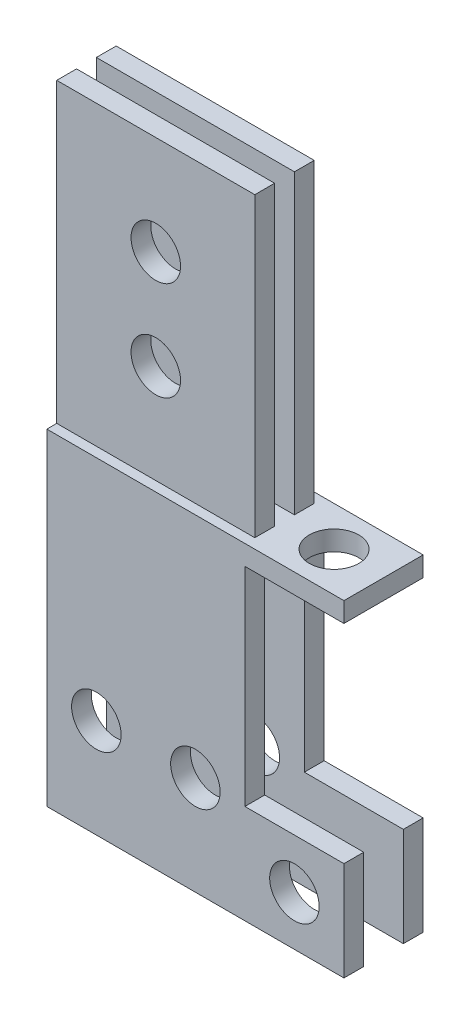
ISO-10303-21;
HEADER;
FILE_DESCRIPTION(('STEP AP214'),'2;1');
FILE_NAME('part.step','',(''),(''),'','','');
FILE_SCHEMA(('AUTOMOTIVE_DESIGN { 1 0 10303 214 1 1 1 1 }'));
ENDSEC;
DATA;
#1=APPLICATION_CONTEXT('core data for automotive mechanical design processes');
#2=APPLICATION_PROTOCOL_DEFINITION('international standard','automotive_design',2000,#1);
#3=PRODUCT_CONTEXT('',#1,'mechanical');
#4=PRODUCT('Part','Part','',(#3));
#5=PRODUCT_RELATED_PRODUCT_CATEGORY('part','',(#4));
#6=PRODUCT_DEFINITION_FORMATION('','',#4);
#7=PRODUCT_DEFINITION_CONTEXT('part definition',#1,'design');
#8=PRODUCT_DEFINITION('design','',#6,#7);
#9=PRODUCT_DEFINITION_SHAPE('','',#8);
#10=(LENGTH_UNIT() NAMED_UNIT(*) SI_UNIT(.MILLI.,.METRE.));
#11=(NAMED_UNIT(*) PLANE_ANGLE_UNIT() SI_UNIT($,.RADIAN.));
#12=(NAMED_UNIT(*) SI_UNIT($,.STERADIAN.) SOLID_ANGLE_UNIT());
#13=UNCERTAINTY_MEASURE_WITH_UNIT(LENGTH_MEASURE(1.E-05),#10,'distance_accuracy_value','');
#14=(GEOMETRIC_REPRESENTATION_CONTEXT(3) GLOBAL_UNCERTAINTY_ASSIGNED_CONTEXT((#13)) GLOBAL_UNIT_ASSIGNED_CONTEXT((#10,
#11,#12)) REPRESENTATION_CONTEXT('',''));
#15=CARTESIAN_POINT('',(0.,0.,0.));
#16=DIRECTION('',(0.,0.,1.));
#17=DIRECTION('',(1.,0.,0.));
#18=AXIS2_PLACEMENT_3D('',#15,#16,#17);
#19=CARTESIAN_POINT('',(0.,37.8144776815525,-4.));
#20=DIRECTION('',(0.,-1.,0.));
#21=DIRECTION('',(1.,0.,0.));
#22=AXIS2_PLACEMENT_3D('',#19,#20,#21);
#23=PLANE('',#22);
#24=CARTESIAN_POINT('',(-9.8418229000039,37.8144776815525,0.));
#25=DIRECTION('',(0.,1.,0.));
#26=DIRECTION('',(-1.,0.,0.));
#27=AXIS2_PLACEMENT_3D('',#24,#25,#26);
#28=CIRCLE('',#27,2.5);
#29=CARTESIAN_POINT('',(-12.3418229000039,37.8144776815525,0.));
#30=VERTEX_POINT('',#29);
#31=EDGE_CURVE('E367',#30,#30,#28,.T.);
#32=ORIENTED_EDGE('',*,*,#31,.F.);
#33=EDGE_LOOP('',(#32));
#34=FACE_BOUND('',#33,.T.);
#35=DIRECTION('',(1.,0.,0.));
#36=VECTOR('',#35,1.);
#37=CARTESIAN_POINT('',(0.,37.8144776815525,-3.));
#38=LINE('',#37,#36);
#39=CARTESIAN_POINT('',(-34.8418229000039,37.8144776815525,-3.));
#40=VERTEX_POINT('',#39);
#41=CARTESIAN_POINT('',(-14.8418229000039,37.8144776815525,-3.));
#42=VERTEX_POINT('',#41);
#43=EDGE_CURVE('E208',#40,#42,#38,.T.);
#44=ORIENTED_EDGE('',*,*,#43,.T.);
#45=DIRECTION('',(0.,0.,1.));
#46=VECTOR('',#45,1.);
#47=CARTESIAN_POINT('',(-14.8418229000039,37.8144776815525,-3.));
#48=LINE('',#47,#46);
#49=CARTESIAN_POINT('',(-14.8418229000039,37.8144776815525,-1.));
#50=VERTEX_POINT('',#49);
#51=EDGE_CURVE('E193',#42,#50,#48,.T.);
#52=ORIENTED_EDGE('',*,*,#51,.T.);
#53=DIRECTION('',(1.,0.,0.));
#54=VECTOR('',#53,1.);
#55=CARTESIAN_POINT('',(0.,37.8144776815525,-1.));
#56=LINE('',#55,#54);
#57=CARTESIAN_POINT('',(-34.8418229000039,37.8144776815525,-1.));
#58=VERTEX_POINT('',#57);
#59=EDGE_CURVE('E236',#58,#50,#56,.T.);
#60=ORIENTED_EDGE('',*,*,#59,.F.);
#61=DIRECTION('',(0.,0.,1.));
#62=VECTOR('',#61,1.);
#63=CARTESIAN_POINT('',(-34.8418229000039,37.8144776815525,-4.));
#64=LINE('',#63,#62);
#65=CARTESIAN_POINT('',(-34.8418229000039,37.8144776815525,1.));
#66=VERTEX_POINT('',#65);
#67=EDGE_CURVE('E501',#58,#66,#64,.T.);
#68=ORIENTED_EDGE('',*,*,#67,.T.);
#69=DIRECTION('',(1.,0.,0.));
#70=VECTOR('',#69,1.);
#71=CARTESIAN_POINT('',(0.,37.8144776815525,1.));
#72=LINE('',#71,#70);
#73=CARTESIAN_POINT('',(-14.8418229000039,37.8144776815525,1.));
#74=VERTEX_POINT('',#73);
#75=EDGE_CURVE('E67',#66,#74,#72,.T.);
#76=ORIENTED_EDGE('',*,*,#75,.T.);
#77=DIRECTION('',(0.,0.,-1.));
#78=VECTOR('',#77,1.);
#79=CARTESIAN_POINT('',(-14.8418229000039,37.8144776815525,3.));
#80=LINE('',#79,#78);
#81=CARTESIAN_POINT('',(-14.8418229000039,37.8144776815525,3.));
#82=VERTEX_POINT('',#81);
#83=EDGE_CURVE('E307',#82,#74,#80,.T.);
#84=ORIENTED_EDGE('',*,*,#83,.F.);
#85=DIRECTION('',(1.,0.,0.));
#86=VECTOR('',#85,1.);
#87=CARTESIAN_POINT('',(0.,37.8144776815525,3.));
#88=LINE('',#87,#86);
#89=CARTESIAN_POINT('',(-34.8418229000039,37.8144776815525,3.));
#90=VERTEX_POINT('',#89);
#91=EDGE_CURVE('E256',#90,#82,#88,.T.);
#92=ORIENTED_EDGE('',*,*,#91,.F.);
#93=CARTESIAN_POINT('',(-34.8418229000039,37.8144776815525,4.));
#94=VERTEX_POINT('',#93);
#95=EDGE_CURVE('E495',#90,#94,#64,.T.);
#96=ORIENTED_EDGE('',*,*,#95,.T.);
#97=DIRECTION('',(1.,0.,0.));
#98=VECTOR('',#97,1.);
#99=CARTESIAN_POINT('',(0.,37.8144776815525,4.));
#100=LINE('',#99,#98);
#101=CARTESIAN_POINT('',(-4.8418229000039,37.8144776815525,4.));
#102=VERTEX_POINT('',#101);
#103=EDGE_CURVE('E481',#94,#102,#100,.T.);
#104=ORIENTED_EDGE('',*,*,#103,.T.);
#105=DIRECTION('',(0.,0.,-1.));
#106=VECTOR('',#105,1.);
#107=CARTESIAN_POINT('',(-4.8418229000039,37.8144776815525,4.));
#108=LINE('',#107,#106);
#109=CARTESIAN_POINT('',(-4.8418229000039,37.8144776815525,-4.));
#110=VERTEX_POINT('',#109);
#111=EDGE_CURVE('E377',#102,#110,#108,.T.);
#112=ORIENTED_EDGE('',*,*,#111,.T.);
#113=DIRECTION('',(1.,0.,0.));
#114=VECTOR('',#113,1.);
#115=CARTESIAN_POINT('',(0.,37.8144776815525,-4.));
#116=LINE('',#115,#114);
#117=CARTESIAN_POINT('',(-34.8418229000039,37.8144776815525,-4.));
#118=VERTEX_POINT('',#117);
#119=EDGE_CURVE('E490',#118,#110,#116,.T.);
#120=ORIENTED_EDGE('',*,*,#119,.F.);
#121=EDGE_CURVE('E45',#118,#40,#64,.T.);
#122=ORIENTED_EDGE('',*,*,#121,.T.);
#123=EDGE_LOOP('',(#44,#52,#60,#68,#76,#84,#92,#96,#104,#112,#120,#122));
#124=FACE_BOUND('',#123,.T.);
#125=ADVANCED_FACE('F41',(#34,#124),#23,.F.);
#126=CARTESIAN_POINT('',(-14.8418229000039,0.,-4.));
#127=DIRECTION('',(-1.,0.,0.));
#128=DIRECTION('',(0.,0.,1.));
#129=AXIS2_PLACEMENT_3D('',#126,#127,#128);
#130=PLANE('',#129);
#131=DIRECTION('',(0.,-1.,0.));
#132=VECTOR('',#131,1.);
#133=CARTESIAN_POINT('',(-14.8418229000039,0.,-4.));
#134=LINE('',#133,#132);
#135=CARTESIAN_POINT('',(-14.8418229000039,35.8144776815525,-4.));
#136=VERTEX_POINT('',#135);
#137=CARTESIAN_POINT('',(-14.8418229000039,14.8144776815525,-4.));
#138=VERTEX_POINT('',#137);
#139=EDGE_CURVE('E487',#136,#138,#134,.T.);
#140=ORIENTED_EDGE('',*,*,#139,.F.);
#141=DIRECTION('',(0.,0.,1.));
#142=VECTOR('',#141,1.);
#143=CARTESIAN_POINT('',(-14.8418229000039,35.8144776815525,4.));
#144=LINE('',#143,#142);
#145=CARTESIAN_POINT('',(-14.8418229000039,35.8144776815525,4.));
#146=VERTEX_POINT('',#145);
#147=EDGE_CURVE('E381',#136,#146,#144,.T.);
#148=ORIENTED_EDGE('',*,*,#147,.T.);
#149=DIRECTION('',(0.,-1.,0.));
#150=VECTOR('',#149,1.);
#151=CARTESIAN_POINT('',(-14.8418229000039,0.,4.));
#152=LINE('',#151,#150);
#153=CARTESIAN_POINT('',(-14.8418229000039,14.8144776815525,4.));
#154=VERTEX_POINT('',#153);
#155=EDGE_CURVE('E478',#146,#154,#152,.T.);
#156=ORIENTED_EDGE('',*,*,#155,.T.);
#157=DIRECTION('',(0.,0.,-1.));
#158=VECTOR('',#157,1.);
#159=CARTESIAN_POINT('',(-14.8418229000039,14.8144776815525,4.));
#160=LINE('',#159,#158);
#161=CARTESIAN_POINT('',(-14.8418229000039,14.8144776815525,2.));
#162=VERTEX_POINT('',#161);
#163=EDGE_CURVE('E432',#154,#162,#160,.T.);
#164=ORIENTED_EDGE('',*,*,#163,.T.);
#165=DIRECTION('',(0.,-1.,0.));
#166=VECTOR('',#165,1.);
#167=CARTESIAN_POINT('',(-14.8418229000039,0.,2.));
#168=LINE('',#167,#166);
#169=CARTESIAN_POINT('',(-14.8418229000039,34.8144776815525,2.));
#170=VERTEX_POINT('',#169);
#171=EDGE_CURVE('E405',#170,#162,#168,.T.);
#172=ORIENTED_EDGE('',*,*,#171,.F.);
#173=DIRECTION('',(0.,0.,1.));
#174=VECTOR('',#173,1.);
#175=CARTESIAN_POINT('',(-14.8418229000039,34.8144776815525,-4.));
#176=LINE('',#175,#174);
#177=CARTESIAN_POINT('',(-14.8418229000039,34.8144776815525,-2.));
#178=VERTEX_POINT('',#177);
#179=EDGE_CURVE('E11',#178,#170,#176,.T.);
#180=ORIENTED_EDGE('',*,*,#179,.F.);
#181=DIRECTION('',(0.,-1.,0.));
#182=VECTOR('',#181,1.);
#183=CARTESIAN_POINT('',(-14.8418229000039,0.,-2.));
#184=LINE('',#183,#182);
#185=CARTESIAN_POINT('',(-14.8418229000039,14.8144776815525,-2.));
#186=VERTEX_POINT('',#185);
#187=EDGE_CURVE('E325',#178,#186,#184,.T.);
#188=ORIENTED_EDGE('',*,*,#187,.T.);
#189=DIRECTION('',(0.,0.,1.));
#190=VECTOR('',#189,1.);
#191=CARTESIAN_POINT('',(-14.8418229000039,14.8144776815525,-4.));
#192=LINE('',#191,#190);
#193=EDGE_CURVE('E349',#138,#186,#192,.T.);
#194=ORIENTED_EDGE('',*,*,#193,.F.);
#195=EDGE_LOOP('',(#140,#148,#156,#164,#172,#180,#188,#194));
#196=FACE_BOUND('',#195,.T.);
#197=ADVANCED_FACE('F43',(#196),#130,.F.);
#198=CARTESIAN_POINT('',(0.,34.8144776815525,-4.));
#199=DIRECTION('',(0.,-1.,0.));
#200=DIRECTION('',(0.,0.,-1.));
#201=AXIS2_PLACEMENT_3D('',#198,#199,#200);
#202=PLANE('',#201);
#203=DIRECTION('',(1.,0.,0.));
#204=VECTOR('',#203,1.);
#205=CARTESIAN_POINT('',(0.,34.8144776815525,-2.));
#206=LINE('',#205,#204);
#207=CARTESIAN_POINT('',(-34.8418229000039,34.8144776815525,-2.));
#208=VERTEX_POINT('',#207);
#209=EDGE_CURVE('E329',#208,#178,#206,.T.);
#210=ORIENTED_EDGE('',*,*,#209,.T.);
#211=ORIENTED_EDGE('',*,*,#179,.T.);
#212=DIRECTION('',(1.,0.,0.));
#213=VECTOR('',#212,1.);
#214=CARTESIAN_POINT('',(0.,34.8144776815525,2.));
#215=LINE('',#214,#213);
#216=CARTESIAN_POINT('',(-34.8418229000039,34.8144776815525,2.));
#217=VERTEX_POINT('',#216);
#218=EDGE_CURVE('E436',#217,#170,#215,.T.);
#219=ORIENTED_EDGE('',*,*,#218,.F.);
#220=DIRECTION('',(0.,0.,1.));
#221=VECTOR('',#220,1.);
#222=CARTESIAN_POINT('',(-34.8418229000039,34.8144776815525,-4.));
#223=LINE('',#222,#221);
#224=EDGE_CURVE('E51',#208,#217,#223,.T.);
#225=ORIENTED_EDGE('',*,*,#224,.F.);
#226=EDGE_LOOP('',(#210,#211,#219,#225));
#227=FACE_BOUND('',#226,.T.);
#228=ADVANCED_FACE('F539',(#227),#202,.T.);
#229=CARTESIAN_POINT('',(-34.8418229000039,0.,-4.));
#230=DIRECTION('',(-1.,0.,0.));
#231=DIRECTION('',(0.,0.,1.));
#232=AXIS2_PLACEMENT_3D('',#229,#230,#231);
#233=PLANE('',#232);
#234=DIRECTION('',(0.,-1.,0.));
#235=VECTOR('',#234,1.);
#236=CARTESIAN_POINT('',(-34.8418229000039,0.,-4.));
#237=LINE('',#236,#235);
#238=CARTESIAN_POINT('',(-34.8418229000039,4.81447768155247,-4.));
#239=VERTEX_POINT('',#238);
#240=EDGE_CURVE('E493',#118,#239,#237,.T.);
#241=ORIENTED_EDGE('',*,*,#240,.T.);
#242=DIRECTION('',(0.,0.,1.));
#243=VECTOR('',#242,1.);
#244=CARTESIAN_POINT('',(-34.8418229000039,4.81447768155247,-4.));
#245=LINE('',#244,#243);
#246=CARTESIAN_POINT('',(-34.8418229000039,4.81447768155247,-2.));
#247=VERTEX_POINT('',#246);
#248=EDGE_CURVE('E324',#239,#247,#245,.T.);
#249=ORIENTED_EDGE('',*,*,#248,.T.);
#250=DIRECTION('',(0.,-1.,0.));
#251=VECTOR('',#250,1.);
#252=CARTESIAN_POINT('',(-34.8418229000039,0.,-2.));
#253=LINE('',#252,#251);
#254=EDGE_CURVE('E333',#208,#247,#253,.T.);
#255=ORIENTED_EDGE('',*,*,#254,.F.);
#256=ORIENTED_EDGE('',*,*,#224,.T.);
#257=DIRECTION('',(0.,-1.,0.));
#258=VECTOR('',#257,1.);
#259=CARTESIAN_POINT('',(-34.8418229000039,0.,2.));
#260=LINE('',#259,#258);
#261=CARTESIAN_POINT('',(-34.8418229000039,4.81447768155247,2.));
#262=VERTEX_POINT('',#261);
#263=EDGE_CURVE('E440',#217,#262,#260,.T.);
#264=ORIENTED_EDGE('',*,*,#263,.T.);
#265=DIRECTION('',(0.,0.,-1.));
#266=VECTOR('',#265,1.);
#267=CARTESIAN_POINT('',(-34.8418229000039,4.81447768155247,4.));
#268=LINE('',#267,#266);
#269=CARTESIAN_POINT('',(-34.8418229000039,4.81447768155247,4.));
#270=VERTEX_POINT('',#269);
#271=EDGE_CURVE('E474',#270,#262,#268,.T.);
#272=ORIENTED_EDGE('',*,*,#271,.F.);
#273=DIRECTION('',(0.,-1.,0.));
#274=VECTOR('',#273,1.);
#275=CARTESIAN_POINT('',(-34.8418229000039,0.,4.));
#276=LINE('',#275,#274);
#277=EDGE_CURVE('E484',#94,#270,#276,.T.);
#278=ORIENTED_EDGE('',*,*,#277,.F.);
#279=ORIENTED_EDGE('',*,*,#95,.F.);
#280=DIRECTION('',(0.,1.,0.));
#281=VECTOR('',#280,1.);
#282=CARTESIAN_POINT('',(-34.8418229000039,0.,3.));
#283=LINE('',#282,#281);
#284=CARTESIAN_POINT('',(-34.8418229000039,67.8144776815525,3.));
#285=VERTEX_POINT('',#284);
#286=EDGE_CURVE('E268',#90,#285,#283,.T.);
#287=ORIENTED_EDGE('',*,*,#286,.T.);
#288=DIRECTION('',(0.,0.,-1.));
#289=VECTOR('',#288,1.);
#290=CARTESIAN_POINT('',(-34.8418229000039,67.8144776815525,3.));
#291=LINE('',#290,#289);
#292=CARTESIAN_POINT('',(-34.8418229000039,67.8144776815525,1.));
#293=VERTEX_POINT('',#292);
#294=EDGE_CURVE('E280',#285,#293,#291,.T.);
#295=ORIENTED_EDGE('',*,*,#294,.T.);
#296=DIRECTION('',(0.,1.,0.));
#297=VECTOR('',#296,1.);
#298=CARTESIAN_POINT('',(-34.8418229000039,0.,1.));
#299=LINE('',#298,#297);
#300=EDGE_CURVE('E291',#66,#293,#299,.T.);
#301=ORIENTED_EDGE('',*,*,#300,.F.);
#302=ORIENTED_EDGE('',*,*,#67,.F.);
#303=DIRECTION('',(0.,1.,0.));
#304=VECTOR('',#303,1.);
#305=CARTESIAN_POINT('',(-34.8418229000039,0.,-1.));
#306=LINE('',#305,#304);
#307=CARTESIAN_POINT('',(-34.8418229000039,67.8144776815525,-1.));
#308=VERTEX_POINT('',#307);
#309=EDGE_CURVE('E59',#58,#308,#306,.T.);
#310=ORIENTED_EDGE('',*,*,#309,.T.);
#311=DIRECTION('',(0.,0.,1.));
#312=VECTOR('',#311,1.);
#313=CARTESIAN_POINT('',(-34.8418229000039,67.8144776815525,-3.));
#314=LINE('',#313,#312);
#315=CARTESIAN_POINT('',(-34.8418229000039,67.8144776815525,-3.));
#316=VERTEX_POINT('',#315);
#317=EDGE_CURVE('E250',#316,#308,#314,.T.);
#318=ORIENTED_EDGE('',*,*,#317,.F.);
#319=DIRECTION('',(0.,1.,0.));
#320=VECTOR('',#319,1.);
#321=CARTESIAN_POINT('',(-34.8418229000039,0.,-3.));
#322=LINE('',#321,#320);
#323=EDGE_CURVE('E226',#40,#316,#322,.T.);
#324=ORIENTED_EDGE('',*,*,#323,.F.);
#325=ORIENTED_EDGE('',*,*,#121,.F.);
#326=EDGE_LOOP('',(#241,#249,#255,#256,#264,#272,#278,#279,#287,#295,#301,#302,#310,#318,#324,#325));
#327=FACE_BOUND('',#326,.T.);
#328=ADVANCED_FACE('F509',(#327),#233,.T.);
#329=CARTESIAN_POINT('',(0.,0.,-4.));
#330=DIRECTION('',(0.,0.,1.));
#331=DIRECTION('',(1.,0.,0.));
#332=AXIS2_PLACEMENT_3D('',#329,#330,#331);
#333=PLANE('',#332);
#334=ORIENTED_EDGE('',*,*,#119,.T.);
#335=DIRECTION('',(0.,1.,0.));
#336=VECTOR('',#335,1.);
#337=CARTESIAN_POINT('',(-4.8418229000039,35.8144776815525,-4.));
#338=LINE('',#337,#336);
#339=CARTESIAN_POINT('',(-4.8418229000039,35.8144776815525,-4.));
#340=VERTEX_POINT('',#339);
#341=EDGE_CURVE('E401',#340,#110,#338,.T.);
#342=ORIENTED_EDGE('',*,*,#341,.F.);
#343=DIRECTION('',(-1.,0.,0.));
#344=VECTOR('',#343,1.);
#345=CARTESIAN_POINT('',(-14.8418229000039,35.8144776815525,-4.));
#346=LINE('',#345,#344);
#347=EDGE_CURVE('E393',#340,#136,#346,.T.);
#348=ORIENTED_EDGE('',*,*,#347,.T.);
#349=ORIENTED_EDGE('',*,*,#139,.T.);
#350=DIRECTION('',(1.,0.,0.));
#351=VECTOR('',#350,1.);
#352=CARTESIAN_POINT('',(-14.8418229000039,14.8144776815525,-4.));
#353=LINE('',#352,#351);
#354=CARTESIAN_POINT('',(-4.8418229000039,14.8144776815525,-4.));
#355=VERTEX_POINT('',#354);
#356=EDGE_CURVE('E354',#138,#355,#353,.T.);
#357=ORIENTED_EDGE('',*,*,#356,.T.);
#358=DIRECTION('',(0.,1.,0.));
#359=VECTOR('',#358,1.);
#360=CARTESIAN_POINT('',(-4.8418229000039,4.81447768155247,-4.));
#361=LINE('',#360,#359);
#362=CARTESIAN_POINT('',(-4.8418229000039,4.81447768155247,-4.));
#363=VERTEX_POINT('',#362);
#364=EDGE_CURVE('E350',#363,#355,#361,.T.);
#365=ORIENTED_EDGE('',*,*,#364,.F.);
#366=DIRECTION('',(1.,0.,0.));
#367=VECTOR('',#366,1.);
#368=CARTESIAN_POINT('',(0.,4.81447768155247,-4.));
#369=LINE('',#368,#367);
#370=EDGE_CURVE('E312',#239,#363,#369,.T.);
#371=ORIENTED_EDGE('',*,*,#370,.F.);
#372=ORIENTED_EDGE('',*,*,#240,.F.);
#373=EDGE_LOOP('',(#334,#342,#348,#349,#357,#365,#371,#372));
#374=FACE_BOUND('',#373,.T.);
#375=CARTESIAN_POINT('',(-29.8418229000039,14.8144776815525,-4.));
#376=DIRECTION('',(0.,0.,1.));
#377=DIRECTION('',(1.,0.,0.));
#378=AXIS2_PLACEMENT_3D('',#375,#376,#377);
#379=CIRCLE('',#378,2.5);
#380=CARTESIAN_POINT('',(-27.3418229000039,14.8144776815525,-4.));
#381=VERTEX_POINT('',#380);
#382=EDGE_CURVE('E315',#381,#381,#379,.T.);
#383=ORIENTED_EDGE('',*,*,#382,.T.);
#384=EDGE_LOOP('',(#383));
#385=FACE_BOUND('',#384,.T.);
#386=CARTESIAN_POINT('',(-19.8418229000039,14.8144776815525,-4.));
#387=DIRECTION('',(0.,0.,1.));
#388=DIRECTION('',(1.,0.,0.));
#389=AXIS2_PLACEMENT_3D('',#386,#387,#388);
#390=CIRCLE('',#389,2.5);
#391=CARTESIAN_POINT('',(-17.3418229000039,14.8144776815525,-4.));
#392=VERTEX_POINT('',#391);
#393=EDGE_CURVE('E320',#392,#392,#390,.F.);
#394=ORIENTED_EDGE('',*,*,#393,.F.);
#395=EDGE_LOOP('',(#394));
#396=FACE_BOUND('',#395,.T.);
#397=ADVANCED_FACE('F522',(#374,#385,#396),#333,.F.);
#398=CARTESIAN_POINT('',(0.,0.,4.));
#399=DIRECTION('',(0.,0.,1.));
#400=DIRECTION('',(1.,0.,0.));
#401=AXIS2_PLACEMENT_3D('',#398,#399,#400);
#402=PLANE('',#401);
#403=ORIENTED_EDGE('',*,*,#155,.F.);
#404=DIRECTION('',(1.,0.,0.));
#405=VECTOR('',#404,1.);
#406=CARTESIAN_POINT('',(-14.8418229000039,35.8144776815525,4.));
#407=LINE('',#406,#405);
#408=CARTESIAN_POINT('',(-4.8418229000039,35.8144776815525,4.));
#409=VERTEX_POINT('',#408);
#410=EDGE_CURVE('E385',#146,#409,#407,.T.);
#411=ORIENTED_EDGE('',*,*,#410,.T.);
#412=DIRECTION('',(0.,1.,0.));
#413=VECTOR('',#412,1.);
#414=CARTESIAN_POINT('',(-4.8418229000039,35.8144776815525,4.));
#415=LINE('',#414,#413);
#416=EDGE_CURVE('E397',#409,#102,#415,.T.);
#417=ORIENTED_EDGE('',*,*,#416,.T.);
#418=ORIENTED_EDGE('',*,*,#103,.F.);
#419=ORIENTED_EDGE('',*,*,#277,.T.);
#420=DIRECTION('',(1.,0.,0.));
#421=VECTOR('',#420,1.);
#422=CARTESIAN_POINT('',(0.,4.81447768155247,4.));
#423=LINE('',#422,#421);
#424=CARTESIAN_POINT('',(-4.8418229000039,4.81447768155247,4.));
#425=VERTEX_POINT('',#424);
#426=EDGE_CURVE('E409',#270,#425,#423,.T.);
#427=ORIENTED_EDGE('',*,*,#426,.T.);
#428=DIRECTION('',(0.,1.,0.));
#429=VECTOR('',#428,1.);
#430=CARTESIAN_POINT('',(-4.8418229000039,0.,4.));
#431=LINE('',#430,#429);
#432=CARTESIAN_POINT('',(-4.8418229000039,14.8144776815525,4.));
#433=VERTEX_POINT('',#432);
#434=EDGE_CURVE('E412',#425,#433,#431,.T.);
#435=ORIENTED_EDGE('',*,*,#434,.T.);
#436=DIRECTION('',(1.,0.,0.));
#437=VECTOR('',#436,1.);
#438=CARTESIAN_POINT('',(0.,14.8144776815525,4.));
#439=LINE('',#438,#437);
#440=EDGE_CURVE('E416',#154,#433,#439,.T.);
#441=ORIENTED_EDGE('',*,*,#440,.F.);
#442=EDGE_LOOP('',(#403,#411,#417,#418,#419,#427,#435,#441));
#443=FACE_BOUND('',#442,.T.);
#444=CARTESIAN_POINT('',(-29.8418229000039,14.8144776815525,4.));
#445=DIRECTION('',(0.,0.,1.));
#446=DIRECTION('',(1.,0.,0.));
#447=AXIS2_PLACEMENT_3D('',#444,#445,#446);
#448=CIRCLE('',#447,2.5);
#449=CARTESIAN_POINT('',(-27.3418229000039,14.8144776815525,4.));
#450=VERTEX_POINT('',#449);
#451=EDGE_CURVE('E420',#450,#450,#448,.T.);
#452=ORIENTED_EDGE('',*,*,#451,.F.);
#453=EDGE_LOOP('',(#452));
#454=FACE_BOUND('',#453,.T.);
#455=CARTESIAN_POINT('',(-19.8418229000039,14.8144776815525,4.));
#456=DIRECTION('',(0.,0.,1.));
#457=DIRECTION('',(1.,0.,0.));
#458=AXIS2_PLACEMENT_3D('',#455,#456,#457);
#459=CIRCLE('',#458,2.5);
#460=CARTESIAN_POINT('',(-17.3418229000039,14.8144776815525,4.));
#461=VERTEX_POINT('',#460);
#462=EDGE_CURVE('E424',#461,#461,#459,.F.);
#463=ORIENTED_EDGE('',*,*,#462,.T.);
#464=EDGE_LOOP('',(#463));
#465=FACE_BOUND('',#464,.T.);
#466=CARTESIAN_POINT('',(-9.8418229000039,9.81447768155247,4.));
#467=DIRECTION('',(0.,0.,1.));
#468=DIRECTION('',(1.,0.,0.));
#469=AXIS2_PLACEMENT_3D('',#466,#467,#468);
#470=CIRCLE('',#469,2.5);
#471=CARTESIAN_POINT('',(-7.3418229000039,9.81447768155247,4.));
#472=VERTEX_POINT('',#471);
#473=EDGE_CURVE('E428',#472,#472,#470,.T.);
#474=ORIENTED_EDGE('',*,*,#473,.F.);
#475=EDGE_LOOP('',(#474));
#476=FACE_BOUND('',#475,.T.);
#477=ADVANCED_FACE('F512',(#443,#454,#465,#476),#402,.T.);
#478=CARTESIAN_POINT('',(0.,4.81447768155247,4.));
#479=DIRECTION('',(0.,1.,0.));
#480=DIRECTION('',(0.,0.,1.));
#481=AXIS2_PLACEMENT_3D('',#478,#479,#480);
#482=PLANE('',#481);
#483=DIRECTION('',(1.,0.,0.));
#484=VECTOR('',#483,1.);
#485=CARTESIAN_POINT('',(0.,4.81447768155247,2.));
#486=LINE('',#485,#484);
#487=CARTESIAN_POINT('',(-4.8418229000039,4.81447768155247,2.));
#488=VERTEX_POINT('',#487);
#489=EDGE_CURVE('E443',#262,#488,#486,.T.);
#490=ORIENTED_EDGE('',*,*,#489,.T.);
#491=DIRECTION('',(0.,0.,-1.));
#492=VECTOR('',#491,1.);
#493=CARTESIAN_POINT('',(-4.8418229000039,4.81447768155247,4.));
#494=LINE('',#493,#492);
#495=EDGE_CURVE('E470',#425,#488,#494,.T.);
#496=ORIENTED_EDGE('',*,*,#495,.F.);
#497=ORIENTED_EDGE('',*,*,#426,.F.);
#498=ORIENTED_EDGE('',*,*,#271,.T.);
#499=EDGE_LOOP('',(#490,#496,#497,#498));
#500=FACE_BOUND('',#499,.T.);
#501=ADVANCED_FACE('F552',(#500),#482,.F.);
#502=CARTESIAN_POINT('',(-4.8418229000039,0.,4.));
#503=DIRECTION('',(-1.,0.,0.));
#504=DIRECTION('',(0.,0.,1.));
#505=AXIS2_PLACEMENT_3D('',#502,#503,#504);
#506=PLANE('',#505);
#507=DIRECTION('',(0.,1.,0.));
#508=VECTOR('',#507,1.);
#509=CARTESIAN_POINT('',(-4.8418229000039,0.,2.));
#510=LINE('',#509,#508);
#511=CARTESIAN_POINT('',(-4.8418229000039,14.8144776815525,2.));
#512=VERTEX_POINT('',#511);
#513=EDGE_CURVE('E446',#488,#512,#510,.T.);
#514=ORIENTED_EDGE('',*,*,#513,.T.);
#515=DIRECTION('',(0.,0.,-1.));
#516=VECTOR('',#515,1.);
#517=CARTESIAN_POINT('',(-4.8418229000039,14.8144776815525,4.));
#518=LINE('',#517,#516);
#519=EDGE_CURVE('E467',#433,#512,#518,.T.);
#520=ORIENTED_EDGE('',*,*,#519,.F.);
#521=ORIENTED_EDGE('',*,*,#434,.F.);
#522=ORIENTED_EDGE('',*,*,#495,.T.);
#523=EDGE_LOOP('',(#514,#520,#521,#522));
#524=FACE_BOUND('',#523,.T.);
#525=ADVANCED_FACE('F558',(#524),#506,.F.);
#526=CARTESIAN_POINT('',(-19.8418229000039,14.8144776815525,4.));
#527=DIRECTION('',(0.,0.,-1.));
#528=DIRECTION('',(-1.,0.,0.));
#529=AXIS2_PLACEMENT_3D('',#526,#527,#528);
#530=CYLINDRICAL_SURFACE('',#529,2.5);
#531=ORIENTED_EDGE('',*,*,#462,.F.);
#532=EDGE_LOOP('',(#531));
#533=FACE_BOUND('',#532,.T.);
#534=CARTESIAN_POINT('',(-19.8418229000039,14.8144776815525,2.));
#535=DIRECTION('',(0.,0.,1.));
#536=DIRECTION('',(1.,0.,0.));
#537=AXIS2_PLACEMENT_3D('',#534,#535,#536);
#538=CIRCLE('',#537,2.5);
#539=CARTESIAN_POINT('',(-17.3418229000039,14.8144776815525,2.));
#540=VERTEX_POINT('',#539);
#541=EDGE_CURVE('E458',#540,#540,#538,.F.);
#542=ORIENTED_EDGE('',*,*,#541,.T.);
#543=EDGE_LOOP('',(#542));
#544=FACE_BOUND('',#543,.T.);
#545=ADVANCED_FACE('F571',(#533,#544),#530,.F.);
#546=CARTESIAN_POINT('',(-29.8418229000039,14.8144776815525,4.));
#547=DIRECTION('',(0.,0.,-1.));
#548=DIRECTION('',(-1.,0.,0.));
#549=AXIS2_PLACEMENT_3D('',#546,#547,#548);
#550=CYLINDRICAL_SURFACE('',#549,2.5);
#551=ORIENTED_EDGE('',*,*,#451,.T.);
#552=EDGE_LOOP('',(#551));
#553=FACE_BOUND('',#552,.T.);
#554=CARTESIAN_POINT('',(-29.8418229000039,14.8144776815525,2.));
#555=DIRECTION('',(0.,0.,1.));
#556=DIRECTION('',(1.,0.,0.));
#557=AXIS2_PLACEMENT_3D('',#554,#555,#556);
#558=CIRCLE('',#557,2.5);
#559=CARTESIAN_POINT('',(-27.3418229000039,14.8144776815525,2.));
#560=VERTEX_POINT('',#559);
#561=EDGE_CURVE('E454',#560,#560,#558,.T.);
#562=ORIENTED_EDGE('',*,*,#561,.F.);
#563=EDGE_LOOP('',(#562));
#564=FACE_BOUND('',#563,.T.);
#565=ADVANCED_FACE('F563',(#553,#564),#550,.F.);
#566=CARTESIAN_POINT('',(0.,14.8144776815525,4.));
#567=DIRECTION('',(0.,1.,0.));
#568=DIRECTION('',(0.,0.,1.));
#569=AXIS2_PLACEMENT_3D('',#566,#567,#568);
#570=PLANE('',#569);
#571=DIRECTION('',(1.,0.,0.));
#572=VECTOR('',#571,1.);
#573=CARTESIAN_POINT('',(0.,14.8144776815525,2.));
#574=LINE('',#573,#572);
#575=EDGE_CURVE('E450',#162,#512,#574,.T.);
#576=ORIENTED_EDGE('',*,*,#575,.F.);
#577=ORIENTED_EDGE('',*,*,#163,.F.);
#578=ORIENTED_EDGE('',*,*,#440,.T.);
#579=ORIENTED_EDGE('',*,*,#519,.T.);
#580=EDGE_LOOP('',(#576,#577,#578,#579));
#581=FACE_BOUND('',#580,.T.);
#582=ADVANCED_FACE('F560',(#581),#570,.T.);
#583=CARTESIAN_POINT('',(-9.8418229000039,9.81447768155247,4.));
#584=DIRECTION('',(0.,0.,-1.));
#585=DIRECTION('',(-1.,0.,0.));
#586=AXIS2_PLACEMENT_3D('',#583,#584,#585);
#587=CYLINDRICAL_SURFACE('',#586,2.5);
#588=ORIENTED_EDGE('',*,*,#473,.T.);
#589=EDGE_LOOP('',(#588));
#590=FACE_BOUND('',#589,.T.);
#591=CARTESIAN_POINT('',(-9.8418229000039,9.81447768155247,2.));
#592=DIRECTION('',(0.,0.,1.));
#593=DIRECTION('',(1.,0.,0.));
#594=AXIS2_PLACEMENT_3D('',#591,#592,#593);
#595=CIRCLE('',#594,2.5);
#596=CARTESIAN_POINT('',(-7.3418229000039,9.81447768155247,2.));
#597=VERTEX_POINT('',#596);
#598=EDGE_CURVE('E413',#597,#597,#595,.T.);
#599=ORIENTED_EDGE('',*,*,#598,.F.);
#600=EDGE_LOOP('',(#599));
#601=FACE_BOUND('',#600,.T.);
#602=ADVANCED_FACE('F562',(#590,#601),#587,.F.);
#603=CARTESIAN_POINT('',(0.,0.,2.));
#604=DIRECTION('',(0.,0.,1.));
#605=DIRECTION('',(1.,0.,0.));
#606=AXIS2_PLACEMENT_3D('',#603,#604,#605);
#607=PLANE('',#606);
#608=ORIENTED_EDGE('',*,*,#171,.T.);
#609=ORIENTED_EDGE('',*,*,#575,.T.);
#610=ORIENTED_EDGE('',*,*,#513,.F.);
#611=ORIENTED_EDGE('',*,*,#489,.F.);
#612=ORIENTED_EDGE('',*,*,#263,.F.);
#613=ORIENTED_EDGE('',*,*,#218,.T.);
#614=EDGE_LOOP('',(#608,#609,#610,#611,#612,#613));
#615=FACE_BOUND('',#614,.T.);
#616=ORIENTED_EDGE('',*,*,#561,.T.);
#617=EDGE_LOOP('',(#616));
#618=FACE_BOUND('',#617,.T.);
#619=ORIENTED_EDGE('',*,*,#541,.F.);
#620=EDGE_LOOP('',(#619));
#621=FACE_BOUND('',#620,.T.);
#622=ORIENTED_EDGE('',*,*,#598,.T.);
#623=EDGE_LOOP('',(#622));
#624=FACE_BOUND('',#623,.T.);
#625=ADVANCED_FACE('F547',(#615,#618,#621,#624),#607,.F.);
#626=CARTESIAN_POINT('',(-4.8418229000039,35.8144776815525,4.));
#627=DIRECTION('',(1.,0.,0.));
#628=DIRECTION('',(0.,1.,0.));
#629=AXIS2_PLACEMENT_3D('',#626,#627,#628);
#630=PLANE('',#629);
#631=ORIENTED_EDGE('',*,*,#111,.F.);
#632=ORIENTED_EDGE('',*,*,#416,.F.);
#633=DIRECTION('',(0.,0.,-1.));
#634=VECTOR('',#633,1.);
#635=CARTESIAN_POINT('',(-4.8418229000039,35.8144776815525,4.));
#636=LINE('',#635,#634);
#637=EDGE_CURVE('E389',#409,#340,#636,.T.);
#638=ORIENTED_EDGE('',*,*,#637,.T.);
#639=ORIENTED_EDGE('',*,*,#341,.T.);
#640=EDGE_LOOP('',(#631,#632,#638,#639));
#641=FACE_BOUND('',#640,.T.);
#642=ADVANCED_FACE('F518',(#641),#630,.T.);
#643=CARTESIAN_POINT('',(0.,35.8144776815525,0.));
#644=DIRECTION('',(0.,-1.,0.));
#645=DIRECTION('',(1.,0.,0.));
#646=AXIS2_PLACEMENT_3D('',#643,#644,#645);
#647=PLANE('',#646);
#648=CARTESIAN_POINT('',(-9.8418229000039,35.8144776815525,0.));
#649=DIRECTION('',(0.,1.,0.));
#650=DIRECTION('',(-1.,0.,0.));
#651=AXIS2_PLACEMENT_3D('',#648,#649,#650);
#652=CIRCLE('',#651,2.5);
#653=CARTESIAN_POINT('',(-12.3418229000039,35.8144776815525,0.));
#654=VERTEX_POINT('',#653);
#655=EDGE_CURVE('E373',#654,#654,#652,.T.);
#656=ORIENTED_EDGE('',*,*,#655,.T.);
#657=EDGE_LOOP('',(#656));
#658=FACE_BOUND('',#657,.T.);
#659=ORIENTED_EDGE('',*,*,#147,.F.);
#660=ORIENTED_EDGE('',*,*,#347,.F.);
#661=ORIENTED_EDGE('',*,*,#637,.F.);
#662=ORIENTED_EDGE('',*,*,#410,.F.);
#663=EDGE_LOOP('',(#659,#660,#661,#662));
#664=FACE_BOUND('',#663,.T.);
#665=ADVANCED_FACE('F606',(#658,#664),#647,.T.);
#666=CARTESIAN_POINT('',(-9.8418229000039,35.8144776815525,0.));
#667=DIRECTION('',(0.,1.,0.));
#668=DIRECTION('',(-1.,0.,0.));
#669=AXIS2_PLACEMENT_3D('',#666,#667,#668);
#670=CYLINDRICAL_SURFACE('',#669,2.5);
#671=ORIENTED_EDGE('',*,*,#655,.F.);
#672=EDGE_LOOP('',(#671));
#673=FACE_BOUND('',#672,.T.);
#674=ORIENTED_EDGE('',*,*,#31,.T.);
#675=EDGE_LOOP('',(#674));
#676=FACE_BOUND('',#675,.T.);
#677=ADVANCED_FACE('F609',(#673,#676),#670,.F.);
#678=CARTESIAN_POINT('',(0.,4.81447768155247,-4.));
#679=DIRECTION('',(0.,-1.,0.));
#680=DIRECTION('',(0.,0.,-1.));
#681=AXIS2_PLACEMENT_3D('',#678,#679,#680);
#682=PLANE('',#681);
#683=DIRECTION('',(1.,0.,0.));
#684=VECTOR('',#683,1.);
#685=CARTESIAN_POINT('',(0.,4.81447768155247,-2.));
#686=LINE('',#685,#684);
#687=CARTESIAN_POINT('',(-4.8418229000039,4.81447768155247,-2.));
#688=VERTEX_POINT('',#687);
#689=EDGE_CURVE('E337',#247,#688,#686,.T.);
#690=ORIENTED_EDGE('',*,*,#689,.F.);
#691=ORIENTED_EDGE('',*,*,#248,.F.);
#692=ORIENTED_EDGE('',*,*,#370,.T.);
#693=DIRECTION('',(0.,0.,1.));
#694=VECTOR('',#693,1.);
#695=CARTESIAN_POINT('',(-4.8418229000039,4.81447768155247,-4.));
#696=LINE('',#695,#694);
#697=EDGE_CURVE('E358',#363,#688,#696,.T.);
#698=ORIENTED_EDGE('',*,*,#697,.T.);
#699=EDGE_LOOP('',(#690,#691,#692,#698));
#700=FACE_BOUND('',#699,.T.);
#701=ADVANCED_FACE('F528',(#700),#682,.T.);
#702=CARTESIAN_POINT('',(-29.8418229000039,14.8144776815525,-4.));
#703=DIRECTION('',(0.,0.,1.));
#704=DIRECTION('',(1.,0.,0.));
#705=AXIS2_PLACEMENT_3D('',#702,#703,#704);
#706=CYLINDRICAL_SURFACE('',#705,2.5);
#707=ORIENTED_EDGE('',*,*,#382,.F.);
#708=EDGE_LOOP('',(#707));
#709=FACE_BOUND('',#708,.T.);
#710=CARTESIAN_POINT('',(-29.8418229000039,14.8144776815525,-2.));
#711=DIRECTION('',(0.,0.,1.));
#712=DIRECTION('',(1.,0.,0.));
#713=AXIS2_PLACEMENT_3D('',#710,#711,#712);
#714=CIRCLE('',#713,2.5);
#715=CARTESIAN_POINT('',(-27.3418229000039,14.8144776815525,-2.));
#716=VERTEX_POINT('',#715);
#717=EDGE_CURVE('E340',#716,#716,#714,.T.);
#718=ORIENTED_EDGE('',*,*,#717,.T.);
#719=EDGE_LOOP('',(#718));
#720=FACE_BOUND('',#719,.T.);
#721=ADVANCED_FACE('F625',(#709,#720),#706,.F.);
#722=CARTESIAN_POINT('',(-19.8418229000039,14.8144776815525,-4.));
#723=DIRECTION('',(0.,0.,1.));
#724=DIRECTION('',(1.,0.,0.));
#725=AXIS2_PLACEMENT_3D('',#722,#723,#724);
#726=CYLINDRICAL_SURFACE('',#725,2.5);
#727=ORIENTED_EDGE('',*,*,#393,.T.);
#728=EDGE_LOOP('',(#727));
#729=FACE_BOUND('',#728,.T.);
#730=CARTESIAN_POINT('',(-19.8418229000039,14.8144776815525,-2.));
#731=DIRECTION('',(0.,0.,1.));
#732=DIRECTION('',(1.,0.,0.));
#733=AXIS2_PLACEMENT_3D('',#730,#731,#732);
#734=CIRCLE('',#733,2.5);
#735=CARTESIAN_POINT('',(-17.3418229000039,14.8144776815525,-2.));
#736=VERTEX_POINT('',#735);
#737=EDGE_CURVE('E316',#736,#736,#734,.F.);
#738=ORIENTED_EDGE('',*,*,#737,.F.);
#739=EDGE_LOOP('',(#738));
#740=FACE_BOUND('',#739,.T.);
#741=ADVANCED_FACE('F628',(#729,#740),#726,.F.);
#742=CARTESIAN_POINT('',(0.,0.,-2.));
#743=DIRECTION('',(0.,0.,1.));
#744=DIRECTION('',(1.,0.,0.));
#745=AXIS2_PLACEMENT_3D('',#742,#743,#744);
#746=PLANE('',#745);
#747=ORIENTED_EDGE('',*,*,#187,.F.);
#748=ORIENTED_EDGE('',*,*,#209,.F.);
#749=ORIENTED_EDGE('',*,*,#254,.T.);
#750=ORIENTED_EDGE('',*,*,#689,.T.);
#751=DIRECTION('',(0.,1.,0.));
#752=VECTOR('',#751,1.);
#753=CARTESIAN_POINT('',(-4.8418229000039,4.81447768155247,-2.));
#754=LINE('',#753,#752);
#755=CARTESIAN_POINT('',(-4.8418229000039,14.8144776815525,-2.));
#756=VERTEX_POINT('',#755);
#757=EDGE_CURVE('E311',#688,#756,#754,.T.);
#758=ORIENTED_EDGE('',*,*,#757,.T.);
#759=DIRECTION('',(1.,0.,0.));
#760=VECTOR('',#759,1.);
#761=CARTESIAN_POINT('',(-14.8418229000039,14.8144776815525,-2.));
#762=LINE('',#761,#760);
#763=EDGE_CURVE('E355',#186,#756,#762,.T.);
#764=ORIENTED_EDGE('',*,*,#763,.F.);
#765=EDGE_LOOP('',(#747,#748,#749,#750,#758,#764));
#766=FACE_BOUND('',#765,.T.);
#767=ORIENTED_EDGE('',*,*,#717,.F.);
#768=EDGE_LOOP('',(#767));
#769=FACE_BOUND('',#768,.T.);
#770=ORIENTED_EDGE('',*,*,#737,.T.);
#771=EDGE_LOOP('',(#770));
#772=FACE_BOUND('',#771,.T.);
#773=ADVANCED_FACE('F533',(#766,#769,#772),#746,.T.);
#774=CARTESIAN_POINT('',(-4.8418229000039,4.81447768155247,-4.));
#775=DIRECTION('',(1.,0.,0.));
#776=DIRECTION('',(0.,0.,-1.));
#777=AXIS2_PLACEMENT_3D('',#774,#775,#776);
#778=PLANE('',#777);
#779=ORIENTED_EDGE('',*,*,#757,.F.);
#780=ORIENTED_EDGE('',*,*,#697,.F.);
#781=ORIENTED_EDGE('',*,*,#364,.T.);
#782=DIRECTION('',(0.,0.,1.));
#783=VECTOR('',#782,1.);
#784=CARTESIAN_POINT('',(-4.8418229000039,14.8144776815525,-4.));
#785=LINE('',#784,#783);
#786=EDGE_CURVE('E330',#355,#756,#785,.T.);
#787=ORIENTED_EDGE('',*,*,#786,.T.);
#788=EDGE_LOOP('',(#779,#780,#781,#787));
#789=FACE_BOUND('',#788,.T.);
#790=ADVANCED_FACE('F615',(#789),#778,.T.);
#791=CARTESIAN_POINT('',(-14.8418229000039,14.8144776815525,-4.));
#792=DIRECTION('',(0.,-1.,0.));
#793=DIRECTION('',(0.,0.,-1.));
#794=AXIS2_PLACEMENT_3D('',#791,#792,#793);
#795=PLANE('',#794);
#796=ORIENTED_EDGE('',*,*,#763,.T.);
#797=ORIENTED_EDGE('',*,*,#786,.F.);
#798=ORIENTED_EDGE('',*,*,#356,.F.);
#799=ORIENTED_EDGE('',*,*,#193,.T.);
#800=EDGE_LOOP('',(#796,#797,#798,#799));
#801=FACE_BOUND('',#800,.T.);
#802=ADVANCED_FACE('F614',(#801),#795,.F.);
#803=CARTESIAN_POINT('',(-14.8418229000039,0.,3.));
#804=DIRECTION('',(-1.,0.,0.));
#805=DIRECTION('',(0.,0.,1.));
#806=AXIS2_PLACEMENT_3D('',#803,#804,#805);
#807=PLANE('',#806);
#808=DIRECTION('',(0.,1.,0.));
#809=VECTOR('',#808,1.);
#810=CARTESIAN_POINT('',(-14.8418229000039,0.,1.));
#811=LINE('',#810,#809);
#812=CARTESIAN_POINT('',(-14.8418229000039,67.8144776815525,1.));
#813=VERTEX_POINT('',#812);
#814=EDGE_CURVE('E283',#74,#813,#811,.T.);
#815=ORIENTED_EDGE('',*,*,#814,.T.);
#816=DIRECTION('',(0.,0.,-1.));
#817=VECTOR('',#816,1.);
#818=CARTESIAN_POINT('',(-14.8418229000039,67.8144776815525,3.));
#819=LINE('',#818,#817);
#820=CARTESIAN_POINT('',(-14.8418229000039,67.8144776815525,3.));
#821=VERTEX_POINT('',#820);
#822=EDGE_CURVE('E304',#821,#813,#819,.T.);
#823=ORIENTED_EDGE('',*,*,#822,.F.);
#824=DIRECTION('',(0.,1.,0.));
#825=VECTOR('',#824,1.);
#826=CARTESIAN_POINT('',(-14.8418229000039,0.,3.));
#827=LINE('',#826,#825);
#828=EDGE_CURVE('E260',#82,#821,#827,.T.);
#829=ORIENTED_EDGE('',*,*,#828,.F.);
#830=ORIENTED_EDGE('',*,*,#83,.T.);
#831=EDGE_LOOP('',(#815,#823,#829,#830));
#832=FACE_BOUND('',#831,.T.);
#833=ADVANCED_FACE('F621',(#832),#807,.F.);
#834=CARTESIAN_POINT('',(0.,67.8144776815525,3.));
#835=DIRECTION('',(0.,1.,0.));
#836=DIRECTION('',(0.,0.,1.));
#837=AXIS2_PLACEMENT_3D('',#834,#835,#836);
#838=PLANE('',#837);
#839=DIRECTION('',(1.,0.,0.));
#840=VECTOR('',#839,1.);
#841=CARTESIAN_POINT('',(0.,67.8144776815525,1.));
#842=LINE('',#841,#840);
#843=EDGE_CURVE('E287',#293,#813,#842,.T.);
#844=ORIENTED_EDGE('',*,*,#843,.F.);
#845=ORIENTED_EDGE('',*,*,#294,.F.);
#846=DIRECTION('',(1.,0.,0.));
#847=VECTOR('',#846,1.);
#848=CARTESIAN_POINT('',(0.,67.8144776815525,3.));
#849=LINE('',#848,#847);
#850=EDGE_CURVE('E264',#285,#821,#849,.T.);
#851=ORIENTED_EDGE('',*,*,#850,.T.);
#852=ORIENTED_EDGE('',*,*,#822,.T.);
#853=EDGE_LOOP('',(#844,#845,#851,#852));
#854=FACE_BOUND('',#853,.T.);
#855=ADVANCED_FACE('F637',(#854),#838,.T.);
#856=CARTESIAN_POINT('',(-24.8418229000039,57.8144776815525,3.));
#857=DIRECTION('',(0.,0.,-1.));
#858=DIRECTION('',(-1.,0.,0.));
#859=AXIS2_PLACEMENT_3D('',#856,#857,#858);
#860=CYLINDRICAL_SURFACE('',#859,2.5);
#861=CARTESIAN_POINT('',(-24.8418229000039,57.8144776815525,3.));
#862=DIRECTION('',(0.,0.,1.));
#863=DIRECTION('',(1.,0.,0.));
#864=AXIS2_PLACEMENT_3D('',#861,#862,#863);
#865=CIRCLE('',#864,2.5);
#866=CARTESIAN_POINT('',(-22.3418229000039,57.8144776815525,3.));
#867=VERTEX_POINT('',#866);
#868=EDGE_CURVE('E272',#867,#867,#865,.T.);
#869=ORIENTED_EDGE('',*,*,#868,.T.);
#870=EDGE_LOOP('',(#869));
#871=FACE_BOUND('',#870,.T.);
#872=CARTESIAN_POINT('',(-24.8418229000039,57.8144776815525,1.));
#873=DIRECTION('',(0.,0.,1.));
#874=DIRECTION('',(1.,0.,0.));
#875=AXIS2_PLACEMENT_3D('',#872,#873,#874);
#876=CIRCLE('',#875,2.5);
#877=CARTESIAN_POINT('',(-22.3418229000039,57.8144776815525,1.));
#878=VERTEX_POINT('',#877);
#879=EDGE_CURVE('E295',#878,#878,#876,.T.);
#880=ORIENTED_EDGE('',*,*,#879,.F.);
#881=EDGE_LOOP('',(#880));
#882=FACE_BOUND('',#881,.T.);
#883=ADVANCED_FACE('F641',(#871,#882),#860,.F.);
#884=CARTESIAN_POINT('',(-24.8418229000039,47.8144776815525,3.));
#885=DIRECTION('',(0.,0.,-1.));
#886=DIRECTION('',(-1.,0.,0.));
#887=AXIS2_PLACEMENT_3D('',#884,#885,#886);
#888=CYLINDRICAL_SURFACE('',#887,2.5);
#889=CARTESIAN_POINT('',(-24.8418229000039,47.8144776815525,3.));
#890=DIRECTION('',(0.,0.,1.));
#891=DIRECTION('',(1.,0.,0.));
#892=AXIS2_PLACEMENT_3D('',#889,#890,#891);
#893=CIRCLE('',#892,2.5);
#894=CARTESIAN_POINT('',(-22.3418229000039,47.8144776815525,3.));
#895=VERTEX_POINT('',#894);
#896=EDGE_CURVE('E276',#895,#895,#893,.F.);
#897=ORIENTED_EDGE('',*,*,#896,.F.);
#898=EDGE_LOOP('',(#897));
#899=FACE_BOUND('',#898,.T.);
#900=CARTESIAN_POINT('',(-24.8418229000039,47.8144776815525,1.));
#901=DIRECTION('',(0.,0.,1.));
#902=DIRECTION('',(1.,0.,0.));
#903=AXIS2_PLACEMENT_3D('',#900,#901,#902);
#904=CIRCLE('',#903,2.5);
#905=CARTESIAN_POINT('',(-22.3418229000039,47.8144776815525,1.));
#906=VERTEX_POINT('',#905);
#907=EDGE_CURVE('E261',#906,#906,#904,.F.);
#908=ORIENTED_EDGE('',*,*,#907,.T.);
#909=EDGE_LOOP('',(#908));
#910=FACE_BOUND('',#909,.T.);
#911=ADVANCED_FACE('F645',(#899,#910),#888,.F.);
#912=CARTESIAN_POINT('',(0.,0.,3.));
#913=DIRECTION('',(0.,0.,1.));
#914=DIRECTION('',(1.,0.,0.));
#915=AXIS2_PLACEMENT_3D('',#912,#913,#914);
#916=PLANE('',#915);
#917=ORIENTED_EDGE('',*,*,#91,.T.);
#918=ORIENTED_EDGE('',*,*,#828,.T.);
#919=ORIENTED_EDGE('',*,*,#850,.F.);
#920=ORIENTED_EDGE('',*,*,#286,.F.);
#921=EDGE_LOOP('',(#917,#918,#919,#920));
#922=FACE_BOUND('',#921,.T.);
#923=ORIENTED_EDGE('',*,*,#868,.F.);
#924=EDGE_LOOP('',(#923));
#925=FACE_BOUND('',#924,.T.);
#926=ORIENTED_EDGE('',*,*,#896,.T.);
#927=EDGE_LOOP('',(#926));
#928=FACE_BOUND('',#927,.T.);
#929=ADVANCED_FACE('F649',(#922,#925,#928),#916,.T.);
#930=CARTESIAN_POINT('',(0.,0.,1.));
#931=DIRECTION('',(0.,0.,1.));
#932=DIRECTION('',(1.,0.,0.));
#933=AXIS2_PLACEMENT_3D('',#930,#931,#932);
#934=PLANE('',#933);
#935=ORIENTED_EDGE('',*,*,#75,.F.);
#936=ORIENTED_EDGE('',*,*,#300,.T.);
#937=ORIENTED_EDGE('',*,*,#843,.T.);
#938=ORIENTED_EDGE('',*,*,#814,.F.);
#939=EDGE_LOOP('',(#935,#936,#937,#938));
#940=FACE_BOUND('',#939,.T.);
#941=ORIENTED_EDGE('',*,*,#879,.T.);
#942=EDGE_LOOP('',(#941));
#943=FACE_BOUND('',#942,.T.);
#944=ORIENTED_EDGE('',*,*,#907,.F.);
#945=EDGE_LOOP('',(#944));
#946=FACE_BOUND('',#945,.T.);
#947=ADVANCED_FACE('F651',(#940,#943,#946),#934,.F.);
#948=CARTESIAN_POINT('',(0.,67.8144776815525,-3.));
#949=DIRECTION('',(0.,-1.,0.));
#950=DIRECTION('',(0.,0.,-1.));
#951=AXIS2_PLACEMENT_3D('',#948,#949,#950);
#952=PLANE('',#951);
#953=DIRECTION('',(1.,0.,0.));
#954=VECTOR('',#953,1.);
#955=CARTESIAN_POINT('',(0.,67.8144776815525,-1.));
#956=LINE('',#955,#954);
#957=CARTESIAN_POINT('',(-14.8418229000039,67.8144776815525,-1.));
#958=VERTEX_POINT('',#957);
#959=EDGE_CURVE('E241',#308,#958,#956,.T.);
#960=ORIENTED_EDGE('',*,*,#959,.T.);
#961=DIRECTION('',(0.,0.,1.));
#962=VECTOR('',#961,1.);
#963=CARTESIAN_POINT('',(-14.8418229000039,67.8144776815525,-3.));
#964=LINE('',#963,#962);
#965=CARTESIAN_POINT('',(-14.8418229000039,67.8144776815525,-3.));
#966=VERTEX_POINT('',#965);
#967=EDGE_CURVE('E201',#966,#958,#964,.T.);
#968=ORIENTED_EDGE('',*,*,#967,.F.);
#969=DIRECTION('',(1.,0.,0.));
#970=VECTOR('',#969,1.);
#971=CARTESIAN_POINT('',(0.,67.8144776815525,-3.));
#972=LINE('',#971,#970);
#973=EDGE_CURVE('E211',#316,#966,#972,.T.);
#974=ORIENTED_EDGE('',*,*,#973,.F.);
#975=ORIENTED_EDGE('',*,*,#317,.T.);
#976=EDGE_LOOP('',(#960,#968,#974,#975));
#977=FACE_BOUND('',#976,.T.);
#978=ADVANCED_FACE('F654',(#977),#952,.F.);
#979=CARTESIAN_POINT('',(-24.8418229000039,57.8144776815525,-3.));
#980=DIRECTION('',(0.,0.,1.));
#981=DIRECTION('',(1.,0.,0.));
#982=AXIS2_PLACEMENT_3D('',#979,#980,#981);
#983=CYLINDRICAL_SURFACE('',#982,2.5);
#984=CARTESIAN_POINT('',(-24.8418229000039,57.8144776815525,-3.));
#985=DIRECTION('',(0.,0.,1.));
#986=DIRECTION('',(1.,0.,0.));
#987=AXIS2_PLACEMENT_3D('',#984,#985,#986);
#988=CIRCLE('',#987,2.5);
#989=CARTESIAN_POINT('',(-22.3418229000039,57.8144776815525,-3.));
#990=VERTEX_POINT('',#989);
#991=EDGE_CURVE('E229',#990,#990,#988,.T.);
#992=ORIENTED_EDGE('',*,*,#991,.F.);
#993=EDGE_LOOP('',(#992));
#994=FACE_BOUND('',#993,.T.);
#995=CARTESIAN_POINT('',(-24.8418229000039,57.8144776815525,-1.));
#996=DIRECTION('',(0.,0.,1.));
#997=DIRECTION('',(1.,0.,0.));
#998=AXIS2_PLACEMENT_3D('',#995,#996,#997);
#999=CIRCLE('',#998,2.5);
#1000=CARTESIAN_POINT('',(-22.3418229000039,57.8144776815525,-1.));
#1001=VERTEX_POINT('',#1000);
#1002=EDGE_CURVE('E221',#1001,#1001,#999,.T.);
#1003=ORIENTED_EDGE('',*,*,#1002,.T.);
#1004=EDGE_LOOP('',(#1003));
#1005=FACE_BOUND('',#1004,.T.);
#1006=ADVANCED_FACE('F662',(#994,#1005),#983,.F.);
#1007=CARTESIAN_POINT('',(-14.8418229000039,0.,-3.));
#1008=DIRECTION('',(1.,0.,0.));
#1009=DIRECTION('',(0.,0.,-1.));
#1010=AXIS2_PLACEMENT_3D('',#1007,#1008,#1009);
#1011=PLANE('',#1010);
#1012=DIRECTION('',(0.,1.,0.));
#1013=VECTOR('',#1012,1.);
#1014=CARTESIAN_POINT('',(-14.8418229000039,0.,-1.));
#1015=LINE('',#1014,#1013);
#1016=EDGE_CURVE('E198',#50,#958,#1015,.T.);
#1017=ORIENTED_EDGE('',*,*,#1016,.F.);
#1018=ORIENTED_EDGE('',*,*,#51,.F.);
#1019=DIRECTION('',(0.,1.,0.));
#1020=VECTOR('',#1019,1.);
#1021=CARTESIAN_POINT('',(-14.8418229000039,0.,-3.));
#1022=LINE('',#1021,#1020);
#1023=EDGE_CURVE('E196',#42,#966,#1022,.T.);
#1024=ORIENTED_EDGE('',*,*,#1023,.T.);
#1025=ORIENTED_EDGE('',*,*,#967,.T.);
#1026=EDGE_LOOP('',(#1017,#1018,#1024,#1025));
#1027=FACE_BOUND('',#1026,.T.);
#1028=ADVANCED_FACE('F195',(#1027),#1011,.T.);
#1029=CARTESIAN_POINT('',(-24.8418229000039,47.8144776815525,-3.));
#1030=DIRECTION('',(0.,0.,1.));
#1031=DIRECTION('',(1.,0.,0.));
#1032=AXIS2_PLACEMENT_3D('',#1029,#1030,#1031);
#1033=CYLINDRICAL_SURFACE('',#1032,2.5);
#1034=CARTESIAN_POINT('',(-24.8418229000039,47.8144776815525,-3.));
#1035=DIRECTION('',(0.,0.,1.));
#1036=DIRECTION('',(1.,0.,0.));
#1037=AXIS2_PLACEMENT_3D('',#1034,#1035,#1036);
#1038=CIRCLE('',#1037,2.5);
#1039=CARTESIAN_POINT('',(-22.3418229000039,47.8144776815525,-3.));
#1040=VERTEX_POINT('',#1039);
#1041=EDGE_CURVE('E202',#1040,#1040,#1038,.F.);
#1042=ORIENTED_EDGE('',*,*,#1041,.T.);
#1043=EDGE_LOOP('',(#1042));
#1044=FACE_BOUND('',#1043,.T.);
#1045=CARTESIAN_POINT('',(-24.8418229000039,47.8144776815525,-1.));
#1046=DIRECTION('',(0.,0.,1.));
#1047=DIRECTION('',(1.,0.,0.));
#1048=AXIS2_PLACEMENT_3D('',#1045,#1046,#1047);
#1049=CIRCLE('',#1048,2.5);
#1050=CARTESIAN_POINT('',(-22.3418229000039,47.8144776815525,-1.));
#1051=VERTEX_POINT('',#1050);
#1052=EDGE_CURVE('E217',#1051,#1051,#1049,.F.);
#1053=ORIENTED_EDGE('',*,*,#1052,.F.);
#1054=EDGE_LOOP('',(#1053));
#1055=FACE_BOUND('',#1054,.T.);
#1056=ADVANCED_FACE('F661',(#1044,#1055),#1033,.F.);
#1057=CARTESIAN_POINT('',(0.,0.,-3.));
#1058=DIRECTION('',(0.,0.,1.));
#1059=DIRECTION('',(1.,0.,0.));
#1060=AXIS2_PLACEMENT_3D('',#1057,#1058,#1059);
#1061=PLANE('',#1060);
#1062=ORIENTED_EDGE('',*,*,#43,.F.);
#1063=ORIENTED_EDGE('',*,*,#323,.T.);
#1064=ORIENTED_EDGE('',*,*,#973,.T.);
#1065=ORIENTED_EDGE('',*,*,#1023,.F.);
#1066=EDGE_LOOP('',(#1062,#1063,#1064,#1065));
#1067=FACE_BOUND('',#1066,.T.);
#1068=ORIENTED_EDGE('',*,*,#991,.T.);
#1069=EDGE_LOOP('',(#1068));
#1070=FACE_BOUND('',#1069,.T.);
#1071=ORIENTED_EDGE('',*,*,#1041,.F.);
#1072=EDGE_LOOP('',(#1071));
#1073=FACE_BOUND('',#1072,.T.);
#1074=ADVANCED_FACE('F206',(#1067,#1070,#1073),#1061,.F.);
#1075=CARTESIAN_POINT('',(0.,0.,-1.));
#1076=DIRECTION('',(0.,0.,1.));
#1077=DIRECTION('',(1.,0.,0.));
#1078=AXIS2_PLACEMENT_3D('',#1075,#1076,#1077);
#1079=PLANE('',#1078);
#1080=ORIENTED_EDGE('',*,*,#59,.T.);
#1081=ORIENTED_EDGE('',*,*,#1016,.T.);
#1082=ORIENTED_EDGE('',*,*,#959,.F.);
#1083=ORIENTED_EDGE('',*,*,#309,.F.);
#1084=EDGE_LOOP('',(#1080,#1081,#1082,#1083));
#1085=FACE_BOUND('',#1084,.T.);
#1086=ORIENTED_EDGE('',*,*,#1002,.F.);
#1087=EDGE_LOOP('',(#1086));
#1088=FACE_BOUND('',#1087,.T.);
#1089=ORIENTED_EDGE('',*,*,#1052,.T.);
#1090=EDGE_LOOP('',(#1089));
#1091=FACE_BOUND('',#1090,.T.);
#1092=ADVANCED_FACE('F672',(#1085,#1088,#1091),#1079,.T.);
#1093=CLOSED_SHELL('',(#125,#197,#228,#328,#397,#477,#501,#525,#545,#565,#582,#602,#625,#642,
#665,#677,#701,#721,#741,#773,#790,#802,#833,#855,#883,#911,#929,#947,#978,#1006,#1028,#1056,
#1074,#1092));
#1094=MANIFOLD_SOLID_BREP('B2',#1093);
#1095=ADVANCED_BREP_SHAPE_REPRESENTATION('',(#18,#1094),#14);
#1096=SHAPE_DEFINITION_REPRESENTATION(#9,#1095);
ENDSEC;
END-ISO-10303-21;
